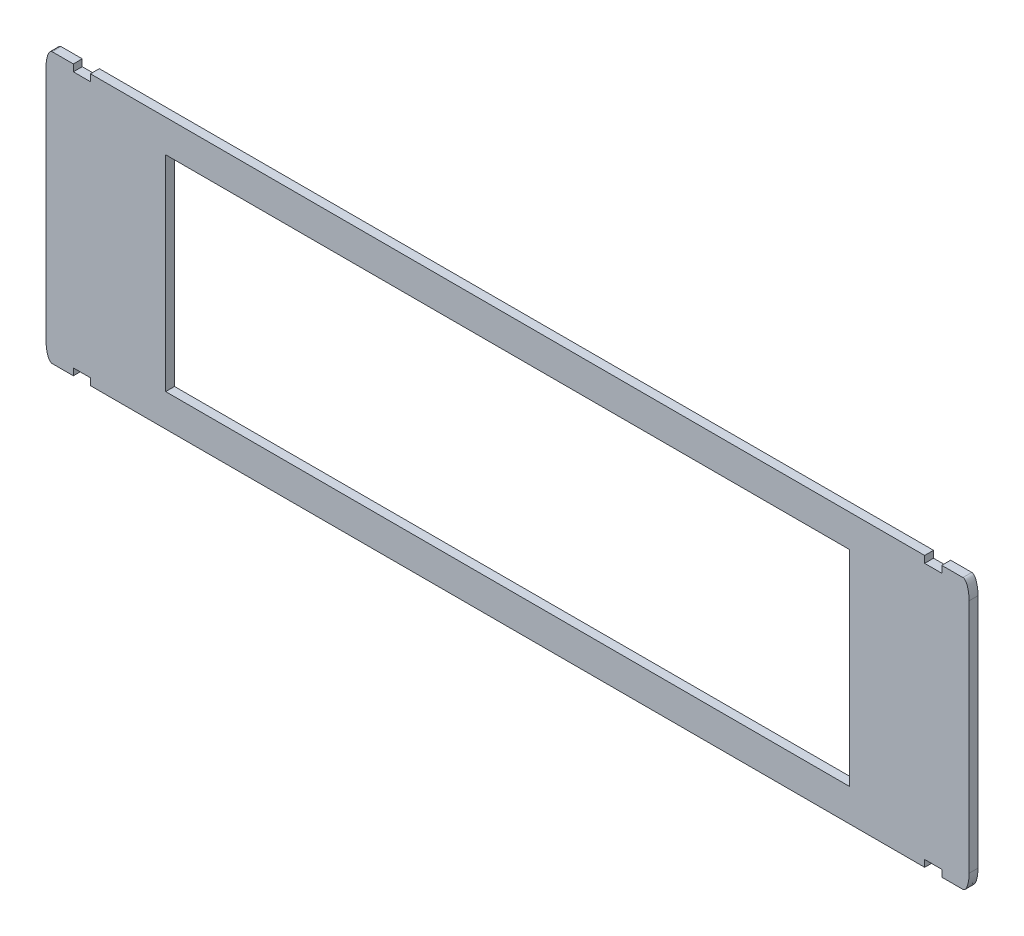
ISO-10303-21;
HEADER;
FILE_DESCRIPTION(('STEP AP214'),'2;1');
FILE_NAME('part.step','',(''),(''),'','','');
FILE_SCHEMA(('AUTOMOTIVE_DESIGN { 1 0 10303 214 1 1 1 1 }'));
ENDSEC;
DATA;
#1=APPLICATION_CONTEXT('core data for automotive mechanical design processes');
#2=APPLICATION_PROTOCOL_DEFINITION('international standard','automotive_design',2000,#1);
#3=PRODUCT_CONTEXT('',#1,'mechanical');
#4=PRODUCT('Part','Part','',(#3));
#5=PRODUCT_RELATED_PRODUCT_CATEGORY('part','',(#4));
#6=PRODUCT_DEFINITION_FORMATION('','',#4);
#7=PRODUCT_DEFINITION_CONTEXT('part definition',#1,'design');
#8=PRODUCT_DEFINITION('design','',#6,#7);
#9=PRODUCT_DEFINITION_SHAPE('','',#8);
#10=(LENGTH_UNIT() NAMED_UNIT(*) SI_UNIT(.MILLI.,.METRE.));
#11=(NAMED_UNIT(*) PLANE_ANGLE_UNIT() SI_UNIT($,.RADIAN.));
#12=(NAMED_UNIT(*) SI_UNIT($,.STERADIAN.) SOLID_ANGLE_UNIT());
#13=UNCERTAINTY_MEASURE_WITH_UNIT(LENGTH_MEASURE(1.E-05),#10,'distance_accuracy_value','');
#14=(GEOMETRIC_REPRESENTATION_CONTEXT(3) GLOBAL_UNCERTAINTY_ASSIGNED_CONTEXT((#13)) GLOBAL_UNIT_ASSIGNED_CONTEXT((#10,
#11,#12)) REPRESENTATION_CONTEXT('',''));
#15=CARTESIAN_POINT('',(0.,0.,0.));
#16=DIRECTION('',(0.,0.,1.));
#17=DIRECTION('',(1.,0.,0.));
#18=AXIS2_PLACEMENT_3D('',#15,#16,#17);
#19=CARTESIAN_POINT('',(-135.,-39.5,2.6));
#20=DIRECTION('',(0.,1.,0.));
#21=DIRECTION('',(0.,0.,1.));
#22=AXIS2_PLACEMENT_3D('',#19,#20,#21);
#23=PLANE('',#22);
#24=DIRECTION('',(1.,0.,0.));
#25=VECTOR('',#24,1.);
#26=CARTESIAN_POINT('',(-135.,-39.5,2.6));
#27=LINE('',#26,#25);
#28=CARTESIAN_POINT('',(127.,-39.5,2.6));
#29=VERTEX_POINT('',#28);
#30=CARTESIAN_POINT('',(133.2,-39.5,2.6));
#31=VERTEX_POINT('',#30);
#32=EDGE_CURVE('E482',#29,#31,#27,.T.);
#33=ORIENTED_EDGE('',*,*,#32,.F.);
#34=DIRECTION('',(0.,0.,-1.));
#35=VECTOR('',#34,1.);
#36=CARTESIAN_POINT('',(127.,-39.5,2.6));
#37=LINE('',#36,#35);
#38=CARTESIAN_POINT('',(127.,-39.5,0.));
#39=VERTEX_POINT('',#38);
#40=EDGE_CURVE('E57',#29,#39,#37,.T.);
#41=ORIENTED_EDGE('',*,*,#40,.T.);
#42=DIRECTION('',(1.,0.,0.));
#43=VECTOR('',#42,1.);
#44=CARTESIAN_POINT('',(-135.,-39.5,0.));
#45=LINE('',#44,#43);
#46=CARTESIAN_POINT('',(133.2,-39.5,0.));
#47=VERTEX_POINT('',#46);
#48=EDGE_CURVE('E463',#39,#47,#45,.T.);
#49=ORIENTED_EDGE('',*,*,#48,.T.);
#50=CARTESIAN_POINT('',(133.2,-39.5,2.73));
#51=CARTESIAN_POINT('',(133.2,-39.5,1.77666666666667));
#52=CARTESIAN_POINT('',(133.2,-39.5,0.823333333333334));
#53=CARTESIAN_POINT('',(133.2,-39.5,-0.13));
#54=(BOUNDED_CURVE() B_SPLINE_CURVE(3,(#50,#51,#52,#53),.UNSPECIFIED.,.F.,
.F.) B_SPLINE_CURVE_WITH_KNOTS((4,4),(-0.00013,0.00273),
.UNSPECIFIED.) CURVE() GEOMETRIC_REPRESENTATION_ITEM() RATIONAL_B_SPLINE_CURVE((1.,1.,1.,1.)) REPRESENTATION_ITEM(''));
#55=EDGE_CURVE('E653',#47,#31,#54,.F.);
#56=ORIENTED_EDGE('',*,*,#55,.T.);
#57=EDGE_LOOP('',(#33,#41,#49,#56));
#58=FACE_BOUND('',#57,.T.);
#59=ADVANCED_FACE('F44',(#58),#23,.F.);
#60=CARTESIAN_POINT('',(0.,0.,2.6));
#61=DIRECTION('',(0.,0.,1.));
#62=DIRECTION('',(1.,0.,0.));
#63=AXIS2_PLACEMENT_3D('',#60,#61,#62);
#64=PLANE('',#63);
#65=DIRECTION('',(0.,1.,0.));
#66=VECTOR('',#65,1.);
#67=CARTESIAN_POINT('',(127.,-39.5,2.6));
#68=LINE('',#67,#66);
#69=CARTESIAN_POINT('',(127.,-37.5,2.6));
#70=VERTEX_POINT('',#69);
#71=EDGE_CURVE('E247',#29,#70,#68,.T.);
#72=ORIENTED_EDGE('',*,*,#71,.F.);
#73=ORIENTED_EDGE('',*,*,#32,.T.);
#74=CARTESIAN_POINT('',(135.,-34.5,2.6));
#75=CARTESIAN_POINT('',(135.,-39.5,2.6));
#76=CARTESIAN_POINT('',(133.2,-39.5,2.6));
#77=(BOUNDED_CURVE() B_SPLINE_CURVE(2,(#74,#75,#76),.UNSPECIFIED.,.F.,
.F.) B_SPLINE_CURVE_WITH_KNOTS((3,3),(0.,1.),
.UNSPECIFIED.) CURVE() GEOMETRIC_REPRESENTATION_ITEM() RATIONAL_B_SPLINE_CURVE((1.,
0.707106781186548,1.)) REPRESENTATION_ITEM(''));
#78=CARTESIAN_POINT('',(135.,-34.5,2.6));
#79=VERTEX_POINT('',#78);
#80=EDGE_CURVE('E664',#31,#79,#77,.F.);
#81=ORIENTED_EDGE('',*,*,#80,.T.);
#82=DIRECTION('',(0.,1.,0.));
#83=VECTOR('',#82,1.);
#84=CARTESIAN_POINT('',(135.,39.5,2.6));
#85=LINE('',#84,#83);
#86=CARTESIAN_POINT('',(135.,34.5,2.6));
#87=VERTEX_POINT('',#86);
#88=EDGE_CURVE('E394',#79,#87,#85,.T.);
#89=ORIENTED_EDGE('',*,*,#88,.T.);
#90=CARTESIAN_POINT('',(133.2,39.5,2.6));
#91=CARTESIAN_POINT('',(135.,39.5,2.6));
#92=CARTESIAN_POINT('',(135.,34.5,2.6));
#93=(BOUNDED_CURVE() B_SPLINE_CURVE(2,(#90,#91,#92),.UNSPECIFIED.,.F.,
.F.) B_SPLINE_CURVE_WITH_KNOTS((3,3),(0.,1.),
.UNSPECIFIED.) CURVE() GEOMETRIC_REPRESENTATION_ITEM() RATIONAL_B_SPLINE_CURVE((1.,
0.707106781186548,1.)) REPRESENTATION_ITEM(''));
#94=CARTESIAN_POINT('',(133.2,39.5,2.6));
#95=VERTEX_POINT('',#94);
#96=EDGE_CURVE('E662',#87,#95,#93,.F.);
#97=ORIENTED_EDGE('',*,*,#96,.T.);
#98=DIRECTION('',(-1.,0.,0.));
#99=VECTOR('',#98,1.);
#100=CARTESIAN_POINT('',(-135.,39.5,2.6));
#101=LINE('',#100,#99);
#102=CARTESIAN_POINT('',(127.,39.5,2.6));
#103=VERTEX_POINT('',#102);
#104=EDGE_CURVE('E568',#95,#103,#101,.T.);
#105=ORIENTED_EDGE('',*,*,#104,.T.);
#106=DIRECTION('',(0.,-1.,0.));
#107=VECTOR('',#106,1.);
#108=CARTESIAN_POINT('',(127.,39.5,2.6));
#109=LINE('',#108,#107);
#110=CARTESIAN_POINT('',(127.,37.5,2.6));
#111=VERTEX_POINT('',#110);
#112=EDGE_CURVE('E271',#103,#111,#109,.T.);
#113=ORIENTED_EDGE('',*,*,#112,.T.);
#114=DIRECTION('',(-1.,0.,0.));
#115=VECTOR('',#114,1.);
#116=CARTESIAN_POINT('',(127.,37.5,2.6));
#117=LINE('',#116,#115);
#118=CARTESIAN_POINT('',(122.,37.5,2.6));
#119=VERTEX_POINT('',#118);
#120=EDGE_CURVE('E279',#111,#119,#117,.T.);
#121=ORIENTED_EDGE('',*,*,#120,.T.);
#122=DIRECTION('',(0.,1.,0.));
#123=VECTOR('',#122,1.);
#124=CARTESIAN_POINT('',(122.,39.5,2.6));
#125=LINE('',#124,#123);
#126=CARTESIAN_POINT('',(122.,39.5,2.6));
#127=VERTEX_POINT('',#126);
#128=EDGE_CURVE('E275',#119,#127,#125,.T.);
#129=ORIENTED_EDGE('',*,*,#128,.T.);
#130=CARTESIAN_POINT('',(-122.,39.5,2.6));
#131=VERTEX_POINT('',#130);
#132=EDGE_CURVE('E566',#127,#131,#101,.T.);
#133=ORIENTED_EDGE('',*,*,#132,.T.);
#134=DIRECTION('',(0.,1.,0.));
#135=VECTOR('',#134,1.);
#136=CARTESIAN_POINT('',(-122.,39.5,2.6));
#137=LINE('',#136,#135);
#138=CARTESIAN_POINT('',(-122.,37.5,2.6));
#139=VERTEX_POINT('',#138);
#140=EDGE_CURVE('E327',#139,#131,#137,.T.);
#141=ORIENTED_EDGE('',*,*,#140,.F.);
#142=DIRECTION('',(1.,0.,0.));
#143=VECTOR('',#142,1.);
#144=CARTESIAN_POINT('',(-127.,37.5,2.6));
#145=LINE('',#144,#143);
#146=CARTESIAN_POINT('',(-127.,37.5,2.6));
#147=VERTEX_POINT('',#146);
#148=EDGE_CURVE('E323',#147,#139,#145,.T.);
#149=ORIENTED_EDGE('',*,*,#148,.F.);
#150=DIRECTION('',(0.,-1.,0.));
#151=VECTOR('',#150,1.);
#152=CARTESIAN_POINT('',(-127.,39.5,2.6));
#153=LINE('',#152,#151);
#154=CARTESIAN_POINT('',(-127.,39.5,2.6));
#155=VERTEX_POINT('',#154);
#156=EDGE_CURVE('E310',#155,#147,#153,.T.);
#157=ORIENTED_EDGE('',*,*,#156,.F.);
#158=CARTESIAN_POINT('',(-133.2,39.5,2.6));
#159=VERTEX_POINT('',#158);
#160=EDGE_CURVE('E399',#155,#159,#101,.T.);
#161=ORIENTED_EDGE('',*,*,#160,.T.);
#162=CARTESIAN_POINT('',(-135.,34.5,2.6));
#163=CARTESIAN_POINT('',(-135.,39.5,2.6));
#164=CARTESIAN_POINT('',(-133.2,39.5,2.6));
#165=(BOUNDED_CURVE() B_SPLINE_CURVE(2,(#162,#163,#164),.UNSPECIFIED.,.F.,
.F.) B_SPLINE_CURVE_WITH_KNOTS((3,3),(0.,1.),
.UNSPECIFIED.) CURVE() GEOMETRIC_REPRESENTATION_ITEM() RATIONAL_B_SPLINE_CURVE((1.,
0.707106781186548,1.)) REPRESENTATION_ITEM(''));
#166=CARTESIAN_POINT('',(-135.,34.5,2.6));
#167=VERTEX_POINT('',#166);
#168=EDGE_CURVE('E655',#159,#167,#165,.F.);
#169=ORIENTED_EDGE('',*,*,#168,.T.);
#170=DIRECTION('',(0.,-1.,0.));
#171=VECTOR('',#170,1.);
#172=CARTESIAN_POINT('',(-135.,39.5,2.6));
#173=LINE('',#172,#171);
#174=CARTESIAN_POINT('',(-135.,-34.5,2.6));
#175=VERTEX_POINT('',#174);
#176=EDGE_CURVE('E496',#167,#175,#173,.T.);
#177=ORIENTED_EDGE('',*,*,#176,.T.);
#178=CARTESIAN_POINT('',(-133.2,-39.5,2.6));
#179=CARTESIAN_POINT('',(-135.,-39.5,2.6));
#180=CARTESIAN_POINT('',(-135.,-34.5,2.6));
#181=(BOUNDED_CURVE() B_SPLINE_CURVE(2,(#178,#179,#180),.UNSPECIFIED.,.F.,
.F.) B_SPLINE_CURVE_WITH_KNOTS((3,3),(0.,1.),
.UNSPECIFIED.) CURVE() GEOMETRIC_REPRESENTATION_ITEM() RATIONAL_B_SPLINE_CURVE((1.,
0.707106781186548,1.)) REPRESENTATION_ITEM(''));
#182=CARTESIAN_POINT('',(-133.2,-39.5,2.6));
#183=VERTEX_POINT('',#182);
#184=EDGE_CURVE('E635',#175,#183,#181,.F.);
#185=ORIENTED_EDGE('',*,*,#184,.T.);
#186=CARTESIAN_POINT('',(-127.,-39.5,2.6));
#187=VERTEX_POINT('',#186);
#188=EDGE_CURVE('E481',#183,#187,#27,.T.);
#189=ORIENTED_EDGE('',*,*,#188,.T.);
#190=DIRECTION('',(0.,1.,0.));
#191=VECTOR('',#190,1.);
#192=CARTESIAN_POINT('',(-127.,-39.5,2.6));
#193=LINE('',#192,#191);
#194=CARTESIAN_POINT('',(-127.,-37.5,2.6));
#195=VERTEX_POINT('',#194);
#196=EDGE_CURVE('E294',#187,#195,#193,.T.);
#197=ORIENTED_EDGE('',*,*,#196,.T.);
#198=DIRECTION('',(1.,0.,0.));
#199=VECTOR('',#198,1.);
#200=CARTESIAN_POINT('',(-127.,-37.5,2.6));
#201=LINE('',#200,#199);
#202=CARTESIAN_POINT('',(-122.,-37.5,2.6));
#203=VERTEX_POINT('',#202);
#204=EDGE_CURVE('E302',#195,#203,#201,.T.);
#205=ORIENTED_EDGE('',*,*,#204,.T.);
#206=DIRECTION('',(0.,-1.,0.));
#207=VECTOR('',#206,1.);
#208=CARTESIAN_POINT('',(-122.,-39.5,2.6));
#209=LINE('',#208,#207);
#210=CARTESIAN_POINT('',(-122.,-39.5,2.6));
#211=VERTEX_POINT('',#210);
#212=EDGE_CURVE('E298',#203,#211,#209,.T.);
#213=ORIENTED_EDGE('',*,*,#212,.T.);
#214=CARTESIAN_POINT('',(122.,-39.5,2.6));
#215=VERTEX_POINT('',#214);
#216=EDGE_CURVE('E477',#211,#215,#27,.T.);
#217=ORIENTED_EDGE('',*,*,#216,.T.);
#218=DIRECTION('',(0.,-1.,0.));
#219=VECTOR('',#218,1.);
#220=CARTESIAN_POINT('',(122.,-39.5,2.6));
#221=LINE('',#220,#219);
#222=CARTESIAN_POINT('',(122.,-37.5,2.6));
#223=VERTEX_POINT('',#222);
#224=EDGE_CURVE('E64',#223,#215,#221,.T.);
#225=ORIENTED_EDGE('',*,*,#224,.F.);
#226=DIRECTION('',(-1.,0.,0.));
#227=VECTOR('',#226,1.);
#228=CARTESIAN_POINT('',(127.,-37.5,2.6));
#229=LINE('',#228,#227);
#230=EDGE_CURVE('E240',#70,#223,#229,.T.);
#231=ORIENTED_EDGE('',*,*,#230,.F.);
#232=EDGE_LOOP('',(#72,#73,#81,#89,#97,#105,#113,#121,#129,#133,#141,#149,#157,#161,#169,#177,
#185,#189,#197,#205,#213,#217,#225,#231));
#233=FACE_BOUND('',#232,.T.);
#234=DIRECTION('',(0.,1.,0.));
#235=VECTOR('',#234,1.);
#236=CARTESIAN_POINT('',(100.,30.,2.6));
#237=LINE('',#236,#235);
#238=CARTESIAN_POINT('',(100.,-30.,2.6));
#239=VERTEX_POINT('',#238);
#240=CARTESIAN_POINT('',(100.,30.,2.6));
#241=VERTEX_POINT('',#240);
#242=EDGE_CURVE('E335',#239,#241,#237,.T.);
#243=ORIENTED_EDGE('',*,*,#242,.F.);
#244=DIRECTION('',(1.,0.,0.));
#245=VECTOR('',#244,1.);
#246=CARTESIAN_POINT('',(-100.,-30.,2.6));
#247=LINE('',#246,#245);
#248=CARTESIAN_POINT('',(-100.,-30.,2.6));
#249=VERTEX_POINT('',#248);
#250=EDGE_CURVE('E350',#249,#239,#247,.T.);
#251=ORIENTED_EDGE('',*,*,#250,.F.);
#252=DIRECTION('',(0.,-1.,0.));
#253=VECTOR('',#252,1.);
#254=CARTESIAN_POINT('',(-100.,30.,2.6));
#255=LINE('',#254,#253);
#256=CARTESIAN_POINT('',(-100.,30.,2.6));
#257=VERTEX_POINT('',#256);
#258=EDGE_CURVE('E369',#257,#249,#255,.T.);
#259=ORIENTED_EDGE('',*,*,#258,.F.);
#260=DIRECTION('',(-1.,0.,0.));
#261=VECTOR('',#260,1.);
#262=CARTESIAN_POINT('',(-100.,30.,2.6));
#263=LINE('',#262,#261);
#264=EDGE_CURVE('E365',#241,#257,#263,.T.);
#265=ORIENTED_EDGE('',*,*,#264,.F.);
#266=EDGE_LOOP('',(#243,#251,#259,#265));
#267=FACE_BOUND('',#266,.T.);
#268=ADVANCED_FACE('F254',(#233,#267),#64,.T.);
#269=CARTESIAN_POINT('',(0.,0.,0.));
#270=DIRECTION('',(0.,0.,1.));
#271=DIRECTION('',(1.,0.,0.));
#272=AXIS2_PLACEMENT_3D('',#269,#270,#271);
#273=PLANE('',#272);
#274=ORIENTED_EDGE('',*,*,#48,.F.);
#275=DIRECTION('',(0.,1.,0.));
#276=VECTOR('',#275,1.);
#277=CARTESIAN_POINT('',(127.,0.,0.));
#278=LINE('',#277,#276);
#279=CARTESIAN_POINT('',(127.,-37.5,0.));
#280=VERTEX_POINT('',#279);
#281=EDGE_CURVE('E268',#39,#280,#278,.T.);
#282=ORIENTED_EDGE('',*,*,#281,.T.);
#283=DIRECTION('',(-1.,0.,0.));
#284=VECTOR('',#283,1.);
#285=CARTESIAN_POINT('',(0.,-37.5,0.));
#286=LINE('',#285,#284);
#287=CARTESIAN_POINT('',(122.,-37.5,0.));
#288=VERTEX_POINT('',#287);
#289=EDGE_CURVE('E12',#280,#288,#286,.T.);
#290=ORIENTED_EDGE('',*,*,#289,.T.);
#291=DIRECTION('',(0.,-1.,0.));
#292=VECTOR('',#291,1.);
#293=CARTESIAN_POINT('',(122.,0.,0.));
#294=LINE('',#293,#292);
#295=CARTESIAN_POINT('',(122.,-39.5,0.));
#296=VERTEX_POINT('',#295);
#297=EDGE_CURVE('E263',#288,#296,#294,.T.);
#298=ORIENTED_EDGE('',*,*,#297,.T.);
#299=CARTESIAN_POINT('',(-122.,-39.5,0.));
#300=VERTEX_POINT('',#299);
#301=EDGE_CURVE('E448',#300,#296,#45,.T.);
#302=ORIENTED_EDGE('',*,*,#301,.F.);
#303=DIRECTION('',(0.,-1.,0.));
#304=VECTOR('',#303,1.);
#305=CARTESIAN_POINT('',(-122.,0.,0.));
#306=LINE('',#305,#304);
#307=CARTESIAN_POINT('',(-122.,-37.5,0.));
#308=VERTEX_POINT('',#307);
#309=EDGE_CURVE('E465',#308,#300,#306,.T.);
#310=ORIENTED_EDGE('',*,*,#309,.F.);
#311=DIRECTION('',(1.,0.,0.));
#312=VECTOR('',#311,1.);
#313=CARTESIAN_POINT('',(0.,-37.5,0.));
#314=LINE('',#313,#312);
#315=CARTESIAN_POINT('',(-127.,-37.5,0.));
#316=VERTEX_POINT('',#315);
#317=EDGE_CURVE('E468',#316,#308,#314,.T.);
#318=ORIENTED_EDGE('',*,*,#317,.F.);
#319=DIRECTION('',(0.,1.,0.));
#320=VECTOR('',#319,1.);
#321=CARTESIAN_POINT('',(-127.,0.,0.));
#322=LINE('',#321,#320);
#323=CARTESIAN_POINT('',(-127.,-39.5,0.));
#324=VERTEX_POINT('',#323);
#325=EDGE_CURVE('E473',#324,#316,#322,.T.);
#326=ORIENTED_EDGE('',*,*,#325,.F.);
#327=CARTESIAN_POINT('',(-133.2,-39.5,0.));
#328=VERTEX_POINT('',#327);
#329=EDGE_CURVE('E400',#328,#324,#45,.T.);
#330=ORIENTED_EDGE('',*,*,#329,.F.);
#331=CARTESIAN_POINT('',(-135.,-34.5,0.));
#332=CARTESIAN_POINT('',(-135.,-39.5,0.));
#333=CARTESIAN_POINT('',(-133.2,-39.5,0.));
#334=(BOUNDED_CURVE() B_SPLINE_CURVE(2,(#331,#332,#333),.UNSPECIFIED.,.F.,
.F.) B_SPLINE_CURVE_WITH_KNOTS((3,3),(0.,1.),
.UNSPECIFIED.) CURVE() GEOMETRIC_REPRESENTATION_ITEM() RATIONAL_B_SPLINE_CURVE((1.,
0.707106781186548,1.)) REPRESENTATION_ITEM(''));
#335=CARTESIAN_POINT('',(-135.,-34.5,0.));
#336=VERTEX_POINT('',#335);
#337=EDGE_CURVE('E644',#328,#336,#334,.F.);
#338=ORIENTED_EDGE('',*,*,#337,.T.);
#339=DIRECTION('',(0.,-1.,0.));
#340=VECTOR('',#339,1.);
#341=CARTESIAN_POINT('',(-135.,39.5,0.));
#342=LINE('',#341,#340);
#343=CARTESIAN_POINT('',(-135.,34.5,0.));
#344=VERTEX_POINT('',#343);
#345=EDGE_CURVE('E449',#344,#336,#342,.T.);
#346=ORIENTED_EDGE('',*,*,#345,.F.);
#347=CARTESIAN_POINT('',(-133.2,39.5,0.));
#348=CARTESIAN_POINT('',(-135.,39.5,0.));
#349=CARTESIAN_POINT('',(-135.,34.5,0.));
#350=(BOUNDED_CURVE() B_SPLINE_CURVE(2,(#347,#348,#349),.UNSPECIFIED.,.F.,
.F.) B_SPLINE_CURVE_WITH_KNOTS((3,3),(0.,1.),
.UNSPECIFIED.) CURVE() GEOMETRIC_REPRESENTATION_ITEM() RATIONAL_B_SPLINE_CURVE((1.,
0.707106781186548,1.)) REPRESENTATION_ITEM(''));
#351=CARTESIAN_POINT('',(-133.2,39.5,0.));
#352=VERTEX_POINT('',#351);
#353=EDGE_CURVE('E641',#344,#352,#350,.F.);
#354=ORIENTED_EDGE('',*,*,#353,.T.);
#355=DIRECTION('',(-1.,0.,0.));
#356=VECTOR('',#355,1.);
#357=CARTESIAN_POINT('',(-135.,39.5,0.));
#358=LINE('',#357,#356);
#359=CARTESIAN_POINT('',(-127.,39.5,0.));
#360=VERTEX_POINT('',#359);
#361=EDGE_CURVE('E528',#360,#352,#358,.T.);
#362=ORIENTED_EDGE('',*,*,#361,.F.);
#363=DIRECTION('',(0.,-1.,0.));
#364=VECTOR('',#363,1.);
#365=CARTESIAN_POINT('',(-127.,0.,0.));
#366=LINE('',#365,#364);
#367=CARTESIAN_POINT('',(-127.,37.5,0.));
#368=VERTEX_POINT('',#367);
#369=EDGE_CURVE('E469',#360,#368,#366,.T.);
#370=ORIENTED_EDGE('',*,*,#369,.T.);
#371=DIRECTION('',(1.,0.,0.));
#372=VECTOR('',#371,1.);
#373=CARTESIAN_POINT('',(0.,37.5,0.));
#374=LINE('',#373,#372);
#375=CARTESIAN_POINT('',(-122.,37.5,0.));
#376=VERTEX_POINT('',#375);
#377=EDGE_CURVE('E542',#368,#376,#374,.T.);
#378=ORIENTED_EDGE('',*,*,#377,.T.);
#379=DIRECTION('',(0.,1.,0.));
#380=VECTOR('',#379,1.);
#381=CARTESIAN_POINT('',(-122.,0.,0.));
#382=LINE('',#381,#380);
#383=CARTESIAN_POINT('',(-122.,39.5,0.));
#384=VERTEX_POINT('',#383);
#385=EDGE_CURVE('E546',#376,#384,#382,.T.);
#386=ORIENTED_EDGE('',*,*,#385,.T.);
#387=CARTESIAN_POINT('',(122.,39.5,0.));
#388=VERTEX_POINT('',#387);
#389=EDGE_CURVE('E483',#388,#384,#358,.T.);
#390=ORIENTED_EDGE('',*,*,#389,.F.);
#391=DIRECTION('',(0.,1.,0.));
#392=VECTOR('',#391,1.);
#393=CARTESIAN_POINT('',(122.,0.,0.));
#394=LINE('',#393,#392);
#395=CARTESIAN_POINT('',(122.,37.5,0.));
#396=VERTEX_POINT('',#395);
#397=EDGE_CURVE('E72',#396,#388,#394,.T.);
#398=ORIENTED_EDGE('',*,*,#397,.F.);
#399=DIRECTION('',(-1.,0.,0.));
#400=VECTOR('',#399,1.);
#401=CARTESIAN_POINT('',(0.,37.5,0.));
#402=LINE('',#401,#400);
#403=CARTESIAN_POINT('',(127.,37.5,0.));
#404=VERTEX_POINT('',#403);
#405=EDGE_CURVE('E500',#404,#396,#402,.T.);
#406=ORIENTED_EDGE('',*,*,#405,.F.);
#407=DIRECTION('',(0.,-1.,0.));
#408=VECTOR('',#407,1.);
#409=CARTESIAN_POINT('',(127.,0.,0.));
#410=LINE('',#409,#408);
#411=CARTESIAN_POINT('',(127.,39.5,0.));
#412=VERTEX_POINT('',#411);
#413=EDGE_CURVE('E291',#412,#404,#410,.T.);
#414=ORIENTED_EDGE('',*,*,#413,.F.);
#415=CARTESIAN_POINT('',(133.2,39.5,0.));
#416=VERTEX_POINT('',#415);
#417=EDGE_CURVE('E516',#416,#412,#358,.T.);
#418=ORIENTED_EDGE('',*,*,#417,.F.);
#419=CARTESIAN_POINT('',(135.,34.5,0.));
#420=CARTESIAN_POINT('',(135.,39.5,0.));
#421=CARTESIAN_POINT('',(133.2,39.5,0.));
#422=(BOUNDED_CURVE() B_SPLINE_CURVE(2,(#419,#420,#421),.UNSPECIFIED.,.F.,
.F.) B_SPLINE_CURVE_WITH_KNOTS((3,3),(0.,1.),
.UNSPECIFIED.) CURVE() GEOMETRIC_REPRESENTATION_ITEM() RATIONAL_B_SPLINE_CURVE((1.,
0.707106781186548,1.)) REPRESENTATION_ITEM(''));
#423=CARTESIAN_POINT('',(135.,34.5,0.));
#424=VERTEX_POINT('',#423);
#425=EDGE_CURVE('E646',#416,#424,#422,.F.);
#426=ORIENTED_EDGE('',*,*,#425,.T.);
#427=DIRECTION('',(0.,1.,0.));
#428=VECTOR('',#427,1.);
#429=CARTESIAN_POINT('',(135.,39.5,0.));
#430=LINE('',#429,#428);
#431=CARTESIAN_POINT('',(135.,-34.5,0.));
#432=VERTEX_POINT('',#431);
#433=EDGE_CURVE('E379',#432,#424,#430,.T.);
#434=ORIENTED_EDGE('',*,*,#433,.F.);
#435=CARTESIAN_POINT('',(133.2,-39.5,0.));
#436=CARTESIAN_POINT('',(135.,-39.5,0.));
#437=CARTESIAN_POINT('',(135.,-34.5,0.));
#438=(BOUNDED_CURVE() B_SPLINE_CURVE(2,(#435,#436,#437),.UNSPECIFIED.,.F.,
.F.) B_SPLINE_CURVE_WITH_KNOTS((3,3),(0.,1.),
.UNSPECIFIED.) CURVE() GEOMETRIC_REPRESENTATION_ITEM() RATIONAL_B_SPLINE_CURVE((1.,
0.707106781186548,1.)) REPRESENTATION_ITEM(''));
#439=EDGE_CURVE('E510',#432,#47,#438,.F.);
#440=ORIENTED_EDGE('',*,*,#439,.T.);
#441=EDGE_LOOP('',(#274,#282,#290,#298,#302,#310,#318,#326,#330,#338,#346,#354,#362,#370,#378,
#386,#390,#398,#406,#414,#418,#426,#434,#440));
#442=FACE_BOUND('',#441,.T.);
#443=DIRECTION('',(1.,0.,0.));
#444=VECTOR('',#443,1.);
#445=CARTESIAN_POINT('',(-100.,-30.,0.));
#446=LINE('',#445,#444);
#447=CARTESIAN_POINT('',(-100.,-30.,0.));
#448=VERTEX_POINT('',#447);
#449=CARTESIAN_POINT('',(100.,-30.,0.));
#450=VERTEX_POINT('',#449);
#451=EDGE_CURVE('E358',#448,#450,#446,.T.);
#452=ORIENTED_EDGE('',*,*,#451,.T.);
#453=DIRECTION('',(0.,1.,0.));
#454=VECTOR('',#453,1.);
#455=CARTESIAN_POINT('',(100.,30.,0.));
#456=LINE('',#455,#454);
#457=CARTESIAN_POINT('',(100.,30.,0.));
#458=VERTEX_POINT('',#457);
#459=EDGE_CURVE('E345',#450,#458,#456,.T.);
#460=ORIENTED_EDGE('',*,*,#459,.T.);
#461=DIRECTION('',(-1.,0.,0.));
#462=VECTOR('',#461,1.);
#463=CARTESIAN_POINT('',(-100.,30.,0.));
#464=LINE('',#463,#462);
#465=CARTESIAN_POINT('',(-100.,30.,0.));
#466=VERTEX_POINT('',#465);
#467=EDGE_CURVE('E349',#458,#466,#464,.T.);
#468=ORIENTED_EDGE('',*,*,#467,.T.);
#469=DIRECTION('',(0.,-1.,0.));
#470=VECTOR('',#469,1.);
#471=CARTESIAN_POINT('',(-100.,30.,0.));
#472=LINE('',#471,#470);
#473=EDGE_CURVE('E354',#466,#448,#472,.T.);
#474=ORIENTED_EDGE('',*,*,#473,.T.);
#475=EDGE_LOOP('',(#452,#460,#468,#474));
#476=FACE_BOUND('',#475,.T.);
#477=ADVANCED_FACE('F507',(#442,#476),#273,.F.);
#478=CARTESIAN_POINT('',(-135.,39.5,2.6));
#479=DIRECTION('',(0.,-1.,0.));
#480=DIRECTION('',(0.,0.,-1.));
#481=AXIS2_PLACEMENT_3D('',#478,#479,#480);
#482=PLANE('',#481);
#483=DIRECTION('',(0.,0.,-1.));
#484=VECTOR('',#483,1.);
#485=CARTESIAN_POINT('',(127.,39.5,2.6));
#486=LINE('',#485,#484);
#487=EDGE_CURVE('E577',#103,#412,#486,.T.);
#488=ORIENTED_EDGE('',*,*,#487,.F.);
#489=ORIENTED_EDGE('',*,*,#104,.F.);
#490=CARTESIAN_POINT('',(133.2,39.5,-0.13));
#491=CARTESIAN_POINT('',(133.2,39.5,0.823333333333334));
#492=CARTESIAN_POINT('',(133.2,39.5,1.77666666666667));
#493=CARTESIAN_POINT('',(133.2,39.5,2.73));
#494=(BOUNDED_CURVE() B_SPLINE_CURVE(3,(#490,#491,#492,#493),.UNSPECIFIED.,.F.,
.F.) B_SPLINE_CURVE_WITH_KNOTS((4,4),(-0.00013,0.00273),
.UNSPECIFIED.) CURVE() GEOMETRIC_REPRESENTATION_ITEM() RATIONAL_B_SPLINE_CURVE((1.,1.,1.,1.)) REPRESENTATION_ITEM(''));
#495=EDGE_CURVE('E671',#95,#416,#494,.F.);
#496=ORIENTED_EDGE('',*,*,#495,.T.);
#497=ORIENTED_EDGE('',*,*,#417,.T.);
#498=EDGE_LOOP('',(#488,#489,#496,#497));
#499=FACE_BOUND('',#498,.T.);
#500=ADVANCED_FACE('F427',(#499),#482,.F.);
#501=DIRECTION('',(0.,0.,1.));
#502=VECTOR('',#501,1.);
#503=CARTESIAN_POINT('',(122.,39.5,2.6));
#504=LINE('',#503,#502);
#505=EDGE_CURVE('E476',#388,#127,#504,.T.);
#506=ORIENTED_EDGE('',*,*,#505,.F.);
#507=ORIENTED_EDGE('',*,*,#389,.T.);
#508=DIRECTION('',(0.,0.,1.));
#509=VECTOR('',#508,1.);
#510=CARTESIAN_POINT('',(-122.,39.5,-0.0170000000000001));
#511=LINE('',#510,#509);
#512=EDGE_CURVE('E336',#384,#131,#511,.T.);
#513=ORIENTED_EDGE('',*,*,#512,.T.);
#514=ORIENTED_EDGE('',*,*,#132,.F.);
#515=EDGE_LOOP('',(#506,#507,#513,#514));
#516=FACE_BOUND('',#515,.T.);
#517=ADVANCED_FACE('F592',(#516),#482,.F.);
#518=DIRECTION('',(0.,0.,1.));
#519=VECTOR('',#518,1.);
#520=CARTESIAN_POINT('',(-127.,-39.5,-0.0170000000000001));
#521=LINE('',#520,#519);
#522=EDGE_CURVE('E306',#324,#187,#521,.T.);
#523=ORIENTED_EDGE('',*,*,#522,.T.);
#524=ORIENTED_EDGE('',*,*,#188,.F.);
#525=CARTESIAN_POINT('',(-133.2,-39.5,-0.13));
#526=CARTESIAN_POINT('',(-133.2,-39.5,0.823333333333334));
#527=CARTESIAN_POINT('',(-133.2,-39.5,1.77666666666667));
#528=CARTESIAN_POINT('',(-133.2,-39.5,2.73));
#529=(BOUNDED_CURVE() B_SPLINE_CURVE(3,(#525,#526,#527,#528),.UNSPECIFIED.,.F.,
.F.) B_SPLINE_CURVE_WITH_KNOTS((4,4),(-0.00013,0.00273),
.UNSPECIFIED.) CURVE() GEOMETRIC_REPRESENTATION_ITEM() RATIONAL_B_SPLINE_CURVE((1.,1.,1.,1.)) REPRESENTATION_ITEM(''));
#530=EDGE_CURVE('E651',#183,#328,#529,.F.);
#531=ORIENTED_EDGE('',*,*,#530,.T.);
#532=ORIENTED_EDGE('',*,*,#329,.T.);
#533=EDGE_LOOP('',(#523,#524,#531,#532));
#534=FACE_BOUND('',#533,.T.);
#535=ADVANCED_FACE('F613',(#534),#23,.F.);
#536=ORIENTED_EDGE('',*,*,#301,.T.);
#537=DIRECTION('',(0.,0.,1.));
#538=VECTOR('',#537,1.);
#539=CARTESIAN_POINT('',(122.,-39.5,2.6));
#540=LINE('',#539,#538);
#541=EDGE_CURVE('E498',#296,#215,#540,.T.);
#542=ORIENTED_EDGE('',*,*,#541,.T.);
#543=ORIENTED_EDGE('',*,*,#216,.F.);
#544=DIRECTION('',(0.,0.,1.));
#545=VECTOR('',#544,1.);
#546=CARTESIAN_POINT('',(-122.,-39.5,-0.0170000000000001));
#547=LINE('',#546,#545);
#548=EDGE_CURVE('E314',#300,#211,#547,.T.);
#549=ORIENTED_EDGE('',*,*,#548,.F.);
#550=EDGE_LOOP('',(#536,#542,#543,#549));
#551=FACE_BOUND('',#550,.T.);
#552=ADVANCED_FACE('F612',(#551),#23,.F.);
#553=ORIENTED_EDGE('',*,*,#160,.F.);
#554=DIRECTION('',(0.,0.,1.));
#555=VECTOR('',#554,1.);
#556=CARTESIAN_POINT('',(-127.,39.5,-0.0170000000000001));
#557=LINE('',#556,#555);
#558=EDGE_CURVE('E332',#360,#155,#557,.T.);
#559=ORIENTED_EDGE('',*,*,#558,.F.);
#560=ORIENTED_EDGE('',*,*,#361,.T.);
#561=CARTESIAN_POINT('',(-133.2,39.5,2.73));
#562=CARTESIAN_POINT('',(-133.2,39.5,1.77666666666667));
#563=CARTESIAN_POINT('',(-133.2,39.5,0.823333333333334));
#564=CARTESIAN_POINT('',(-133.2,39.5,-0.13));
#565=(BOUNDED_CURVE() B_SPLINE_CURVE(3,(#561,#562,#563,#564),.UNSPECIFIED.,.F.,
.F.) B_SPLINE_CURVE_WITH_KNOTS((4,4),(-0.00013,0.00273),
.UNSPECIFIED.) CURVE() GEOMETRIC_REPRESENTATION_ITEM() RATIONAL_B_SPLINE_CURVE((1.,1.,1.,1.)) REPRESENTATION_ITEM(''));
#566=EDGE_CURVE('E562',#352,#159,#565,.F.);
#567=ORIENTED_EDGE('',*,*,#566,.T.);
#568=EDGE_LOOP('',(#553,#559,#560,#567));
#569=FACE_BOUND('',#568,.T.);
#570=ADVANCED_FACE('F426',(#569),#482,.F.);
#571=CARTESIAN_POINT('',(135.,39.5,2.6));
#572=DIRECTION('',(-1.,0.,0.));
#573=DIRECTION('',(0.,0.,1.));
#574=AXIS2_PLACEMENT_3D('',#571,#572,#573);
#575=PLANE('',#574);
#576=ORIENTED_EDGE('',*,*,#88,.F.);
#577=CARTESIAN_POINT('',(135.,-34.5,-0.13));
#578=CARTESIAN_POINT('',(135.,-34.5,0.823333333333334));
#579=CARTESIAN_POINT('',(135.,-34.5,1.77666666666667));
#580=CARTESIAN_POINT('',(135.,-34.5,2.73));
#581=(BOUNDED_CURVE() B_SPLINE_CURVE(3,(#577,#578,#579,#580),.UNSPECIFIED.,.F.,
.F.) B_SPLINE_CURVE_WITH_KNOTS((4,4),(-0.00013,0.00273),
.UNSPECIFIED.) CURVE() GEOMETRIC_REPRESENTATION_ITEM() RATIONAL_B_SPLINE_CURVE((1.,1.,1.,1.)) REPRESENTATION_ITEM(''));
#582=EDGE_CURVE('E639',#79,#432,#581,.F.);
#583=ORIENTED_EDGE('',*,*,#582,.T.);
#584=ORIENTED_EDGE('',*,*,#433,.T.);
#585=CARTESIAN_POINT('',(135.,34.5,2.73));
#586=CARTESIAN_POINT('',(135.,34.5,1.77666666666667));
#587=CARTESIAN_POINT('',(135.,34.5,0.823333333333334));
#588=CARTESIAN_POINT('',(135.,34.5,-0.13));
#589=(BOUNDED_CURVE() B_SPLINE_CURVE(3,(#585,#586,#587,#588),.UNSPECIFIED.,.F.,
.F.) B_SPLINE_CURVE_WITH_KNOTS((4,4),(-0.00013,0.00273),
.UNSPECIFIED.) CURVE() GEOMETRIC_REPRESENTATION_ITEM() RATIONAL_B_SPLINE_CURVE((1.,1.,1.,1.)) REPRESENTATION_ITEM(''));
#590=EDGE_CURVE('E408',#424,#87,#589,.F.);
#591=ORIENTED_EDGE('',*,*,#590,.T.);
#592=EDGE_LOOP('',(#576,#583,#584,#591));
#593=FACE_BOUND('',#592,.T.);
#594=ADVANCED_FACE('F415',(#593),#575,.F.);
#595=CARTESIAN_POINT('',(-135.,39.5,2.6));
#596=DIRECTION('',(1.,0.,0.));
#597=DIRECTION('',(0.,0.,-1.));
#598=AXIS2_PLACEMENT_3D('',#595,#596,#597);
#599=PLANE('',#598);
#600=ORIENTED_EDGE('',*,*,#345,.T.);
#601=CARTESIAN_POINT('',(-135.,-34.5,2.73));
#602=CARTESIAN_POINT('',(-135.,-34.5,1.77666666666667));
#603=CARTESIAN_POINT('',(-135.,-34.5,0.823333333333334));
#604=CARTESIAN_POINT('',(-135.,-34.5,-0.13));
#605=(BOUNDED_CURVE() B_SPLINE_CURVE(3,(#601,#602,#603,#604),.UNSPECIFIED.,.F.,
.F.) B_SPLINE_CURVE_WITH_KNOTS((4,4),(-0.00013,0.00273),
.UNSPECIFIED.) CURVE() GEOMETRIC_REPRESENTATION_ITEM() RATIONAL_B_SPLINE_CURVE((1.,1.,1.,1.)) REPRESENTATION_ITEM(''));
#606=EDGE_CURVE('E547',#336,#175,#605,.F.);
#607=ORIENTED_EDGE('',*,*,#606,.T.);
#608=ORIENTED_EDGE('',*,*,#176,.F.);
#609=CARTESIAN_POINT('',(-135.,34.5,-0.13));
#610=CARTESIAN_POINT('',(-135.,34.5,0.823333333333334));
#611=CARTESIAN_POINT('',(-135.,34.5,1.77666666666667));
#612=CARTESIAN_POINT('',(-135.,34.5,2.73));
#613=(BOUNDED_CURVE() B_SPLINE_CURVE(3,(#609,#610,#611,#612),.UNSPECIFIED.,.F.,
.F.) B_SPLINE_CURVE_WITH_KNOTS((4,4),(-0.00013,0.00273),
.UNSPECIFIED.) CURVE() GEOMETRIC_REPRESENTATION_ITEM() RATIONAL_B_SPLINE_CURVE((1.,1.,1.,1.)) REPRESENTATION_ITEM(''));
#614=EDGE_CURVE('E673',#167,#344,#613,.F.);
#615=ORIENTED_EDGE('',*,*,#614,.T.);
#616=EDGE_LOOP('',(#600,#607,#608,#615));
#617=FACE_BOUND('',#616,.T.);
#618=ADVANCED_FACE('F425',(#617),#599,.F.);
#619=CARTESIAN_POINT('',(100.,30.,0.));
#620=DIRECTION('',(1.,0.,0.));
#621=DIRECTION('',(0.,1.,0.));
#622=AXIS2_PLACEMENT_3D('',#619,#620,#621);
#623=PLANE('',#622);
#624=ORIENTED_EDGE('',*,*,#242,.T.);
#625=DIRECTION('',(0.,0.,1.));
#626=VECTOR('',#625,1.);
#627=CARTESIAN_POINT('',(100.,30.,0.));
#628=LINE('',#627,#626);
#629=EDGE_CURVE('E362',#458,#241,#628,.T.);
#630=ORIENTED_EDGE('',*,*,#629,.F.);
#631=ORIENTED_EDGE('',*,*,#459,.F.);
#632=DIRECTION('',(0.,0.,1.));
#633=VECTOR('',#632,1.);
#634=CARTESIAN_POINT('',(100.,-30.,0.));
#635=LINE('',#634,#633);
#636=EDGE_CURVE('E376',#450,#239,#635,.T.);
#637=ORIENTED_EDGE('',*,*,#636,.T.);
#638=EDGE_LOOP('',(#624,#630,#631,#637));
#639=FACE_BOUND('',#638,.T.);
#640=ADVANCED_FACE('F772',(#639),#623,.F.);
#641=CARTESIAN_POINT('',(-100.,-30.,0.));
#642=DIRECTION('',(0.,-1.,0.));
#643=DIRECTION('',(0.,0.,-1.));
#644=AXIS2_PLACEMENT_3D('',#641,#642,#643);
#645=PLANE('',#644);
#646=ORIENTED_EDGE('',*,*,#250,.T.);
#647=ORIENTED_EDGE('',*,*,#636,.F.);
#648=ORIENTED_EDGE('',*,*,#451,.F.);
#649=DIRECTION('',(0.,0.,1.));
#650=VECTOR('',#649,1.);
#651=CARTESIAN_POINT('',(-100.,-30.,0.));
#652=LINE('',#651,#650);
#653=EDGE_CURVE('E380',#448,#249,#652,.T.);
#654=ORIENTED_EDGE('',*,*,#653,.T.);
#655=EDGE_LOOP('',(#646,#647,#648,#654));
#656=FACE_BOUND('',#655,.T.);
#657=ADVANCED_FACE('F768',(#656),#645,.F.);
#658=CARTESIAN_POINT('',(-100.,30.,0.));
#659=DIRECTION('',(-1.,0.,0.));
#660=DIRECTION('',(0.,0.,1.));
#661=AXIS2_PLACEMENT_3D('',#658,#659,#660);
#662=PLANE('',#661);
#663=ORIENTED_EDGE('',*,*,#258,.T.);
#664=ORIENTED_EDGE('',*,*,#653,.F.);
#665=ORIENTED_EDGE('',*,*,#473,.F.);
#666=DIRECTION('',(0.,0.,1.));
#667=VECTOR('',#666,1.);
#668=CARTESIAN_POINT('',(-100.,30.,0.));
#669=LINE('',#668,#667);
#670=EDGE_CURVE('E383',#466,#257,#669,.T.);
#671=ORIENTED_EDGE('',*,*,#670,.T.);
#672=EDGE_LOOP('',(#663,#664,#665,#671));
#673=FACE_BOUND('',#672,.T.);
#674=ADVANCED_FACE('F771',(#673),#662,.F.);
#675=CARTESIAN_POINT('',(-100.,30.,0.));
#676=DIRECTION('',(0.,1.,0.));
#677=DIRECTION('',(0.,0.,1.));
#678=AXIS2_PLACEMENT_3D('',#675,#676,#677);
#679=PLANE('',#678);
#680=ORIENTED_EDGE('',*,*,#264,.T.);
#681=ORIENTED_EDGE('',*,*,#670,.F.);
#682=ORIENTED_EDGE('',*,*,#467,.F.);
#683=ORIENTED_EDGE('',*,*,#629,.T.);
#684=EDGE_LOOP('',(#680,#681,#682,#683));
#685=FACE_BOUND('',#684,.T.);
#686=ADVANCED_FACE('F776',(#685),#679,.F.);
#687=CARTESIAN_POINT('',(135.,-34.5,2.73));
#688=CARTESIAN_POINT('',(135.,-34.5,1.77666666666667));
#689=CARTESIAN_POINT('',(135.,-34.5,0.823333333333334));
#690=CARTESIAN_POINT('',(135.,-34.5,-0.13));
#691=CARTESIAN_POINT('',(135.,-39.5,2.73));
#692=CARTESIAN_POINT('',(135.,-39.5,1.77666666666667));
#693=CARTESIAN_POINT('',(135.,-39.5,0.823333333333333));
#694=CARTESIAN_POINT('',(135.,-39.5,-0.13));
#695=CARTESIAN_POINT('',(133.2,-39.5,2.73));
#696=CARTESIAN_POINT('',(133.2,-39.5,1.77666666666667));
#697=CARTESIAN_POINT('',(133.2,-39.5,0.823333333333334));
#698=CARTESIAN_POINT('',(133.2,-39.5,-0.13));
#699=(BOUNDED_SURFACE() B_SPLINE_SURFACE(2,3,((#687,#688,#689,#690),(#691,#692,#693,#694),(#695,
#696,#697,#698)),.UNSPECIFIED.,.F.,.F.,.F.) B_SPLINE_SURFACE_WITH_KNOTS((3,3),(4,4),(0.,1.),
(-0.00013,0.00273),
.UNSPECIFIED.) GEOMETRIC_REPRESENTATION_ITEM() RATIONAL_B_SPLINE_SURFACE(((1.,1.,1.,1.),
(0.707106781186548,0.707106781186548,0.707106781186548,0.707106781186548),(1.,1.,1.,1.))) REPRESENTATION_ITEM('') SURFACE());
#700=ORIENTED_EDGE('',*,*,#80,.F.);
#701=ORIENTED_EDGE('',*,*,#55,.F.);
#702=ORIENTED_EDGE('',*,*,#439,.F.);
#703=ORIENTED_EDGE('',*,*,#582,.F.);
#704=EDGE_LOOP('',(#700,#701,#702,#703));
#705=FACE_BOUND('',#704,.T.);
#706=ADVANCED_FACE('F431',(#705),#699,.T.);
#707=CARTESIAN_POINT('',(133.2,39.5,2.73));
#708=CARTESIAN_POINT('',(133.2,39.5,1.77666666666667));
#709=CARTESIAN_POINT('',(133.2,39.5,0.823333333333334));
#710=CARTESIAN_POINT('',(133.2,39.5,-0.13));
#711=CARTESIAN_POINT('',(135.,39.5,2.73));
#712=CARTESIAN_POINT('',(135.,39.5,1.77666666666667));
#713=CARTESIAN_POINT('',(135.,39.5,0.823333333333333));
#714=CARTESIAN_POINT('',(135.,39.5,-0.13));
#715=CARTESIAN_POINT('',(135.,34.5,2.73));
#716=CARTESIAN_POINT('',(135.,34.5,1.77666666666667));
#717=CARTESIAN_POINT('',(135.,34.5,0.823333333333334));
#718=CARTESIAN_POINT('',(135.,34.5,-0.13));
#719=(BOUNDED_SURFACE() B_SPLINE_SURFACE(2,3,((#707,#708,#709,#710),(#711,#712,#713,#714),(#715,
#716,#717,#718)),.UNSPECIFIED.,.F.,.F.,.F.) B_SPLINE_SURFACE_WITH_KNOTS((3,3),(4,4),(0.,1.),
(-0.00013,0.00273),
.UNSPECIFIED.) GEOMETRIC_REPRESENTATION_ITEM() RATIONAL_B_SPLINE_SURFACE(((1.,1.,1.,1.),
(0.707106781186548,0.707106781186548,0.707106781186548,0.707106781186548),(1.,1.,1.,1.))) REPRESENTATION_ITEM('') SURFACE());
#720=ORIENTED_EDGE('',*,*,#96,.F.);
#721=ORIENTED_EDGE('',*,*,#590,.F.);
#722=ORIENTED_EDGE('',*,*,#425,.F.);
#723=ORIENTED_EDGE('',*,*,#495,.F.);
#724=EDGE_LOOP('',(#720,#721,#722,#723));
#725=FACE_BOUND('',#724,.T.);
#726=ADVANCED_FACE('F710',(#725),#719,.T.);
#727=CARTESIAN_POINT('',(-133.2,-39.5,2.73));
#728=CARTESIAN_POINT('',(-133.2,-39.5,1.77666666666667));
#729=CARTESIAN_POINT('',(-133.2,-39.5,0.823333333333334));
#730=CARTESIAN_POINT('',(-133.2,-39.5,-0.13));
#731=CARTESIAN_POINT('',(-135.,-39.5,2.73));
#732=CARTESIAN_POINT('',(-135.,-39.5,1.77666666666667));
#733=CARTESIAN_POINT('',(-135.,-39.5,0.823333333333333));
#734=CARTESIAN_POINT('',(-135.,-39.5,-0.13));
#735=CARTESIAN_POINT('',(-135.,-34.5,2.73));
#736=CARTESIAN_POINT('',(-135.,-34.5,1.77666666666667));
#737=CARTESIAN_POINT('',(-135.,-34.5,0.823333333333334));
#738=CARTESIAN_POINT('',(-135.,-34.5,-0.13));
#739=(BOUNDED_SURFACE() B_SPLINE_SURFACE(2,3,((#727,#728,#729,#730),(#731,#732,#733,#734),(#735,
#736,#737,#738)),.UNSPECIFIED.,.F.,.F.,.F.) B_SPLINE_SURFACE_WITH_KNOTS((3,3),(4,4),(0.,1.),
(-0.00013,0.00273),
.UNSPECIFIED.) GEOMETRIC_REPRESENTATION_ITEM() RATIONAL_B_SPLINE_SURFACE(((1.,1.,1.,1.),
(0.707106781186548,0.707106781186548,0.707106781186548,0.707106781186548),(1.,1.,1.,1.))) REPRESENTATION_ITEM('') SURFACE());
#740=ORIENTED_EDGE('',*,*,#184,.F.);
#741=ORIENTED_EDGE('',*,*,#606,.F.);
#742=ORIENTED_EDGE('',*,*,#337,.F.);
#743=ORIENTED_EDGE('',*,*,#530,.F.);
#744=EDGE_LOOP('',(#740,#741,#742,#743));
#745=FACE_BOUND('',#744,.T.);
#746=ADVANCED_FACE('F688',(#745),#739,.T.);
#747=CARTESIAN_POINT('',(-135.,34.5,2.73));
#748=CARTESIAN_POINT('',(-135.,34.5,1.77666666666667));
#749=CARTESIAN_POINT('',(-135.,34.5,0.823333333333334));
#750=CARTESIAN_POINT('',(-135.,34.5,-0.13));
#751=CARTESIAN_POINT('',(-135.,39.5,2.73));
#752=CARTESIAN_POINT('',(-135.,39.5,1.77666666666667));
#753=CARTESIAN_POINT('',(-135.,39.5,0.823333333333333));
#754=CARTESIAN_POINT('',(-135.,39.5,-0.13));
#755=CARTESIAN_POINT('',(-133.2,39.5,2.73));
#756=CARTESIAN_POINT('',(-133.2,39.5,1.77666666666667));
#757=CARTESIAN_POINT('',(-133.2,39.5,0.823333333333334));
#758=CARTESIAN_POINT('',(-133.2,39.5,-0.13));
#759=(BOUNDED_SURFACE() B_SPLINE_SURFACE(2,3,((#747,#748,#749,#750),(#751,#752,#753,#754),(#755,
#756,#757,#758)),.UNSPECIFIED.,.F.,.F.,.F.) B_SPLINE_SURFACE_WITH_KNOTS((3,3),(4,4),(0.,1.),
(-0.00013,0.00273),
.UNSPECIFIED.) GEOMETRIC_REPRESENTATION_ITEM() RATIONAL_B_SPLINE_SURFACE(((1.,1.,1.,1.),
(0.707106781186548,0.707106781186548,0.707106781186548,0.707106781186548),(1.,1.,1.,1.))) REPRESENTATION_ITEM('') SURFACE());
#760=ORIENTED_EDGE('',*,*,#168,.F.);
#761=ORIENTED_EDGE('',*,*,#566,.F.);
#762=ORIENTED_EDGE('',*,*,#353,.F.);
#763=ORIENTED_EDGE('',*,*,#614,.F.);
#764=EDGE_LOOP('',(#760,#761,#762,#763));
#765=FACE_BOUND('',#764,.T.);
#766=ADVANCED_FACE('F47',(#765),#759,.T.);
#767=CARTESIAN_POINT('',(-127.,39.5,-0.0170000000000001));
#768=DIRECTION('',(-1.,0.,0.));
#769=DIRECTION('',(0.,0.,1.));
#770=AXIS2_PLACEMENT_3D('',#767,#768,#769);
#771=PLANE('',#770);
#772=ORIENTED_EDGE('',*,*,#558,.T.);
#773=ORIENTED_EDGE('',*,*,#156,.T.);
#774=DIRECTION('',(0.,0.,1.));
#775=VECTOR('',#774,1.);
#776=CARTESIAN_POINT('',(-127.,37.5,-0.0170000000000001));
#777=LINE('',#776,#775);
#778=EDGE_CURVE('E331',#368,#147,#777,.T.);
#779=ORIENTED_EDGE('',*,*,#778,.F.);
#780=ORIENTED_EDGE('',*,*,#369,.F.);
#781=EDGE_LOOP('',(#772,#773,#779,#780));
#782=FACE_BOUND('',#781,.T.);
#783=ADVANCED_FACE('F556',(#782),#771,.F.);
#784=CARTESIAN_POINT('',(-122.,39.5,-0.0170000000000001));
#785=DIRECTION('',(1.,0.,0.));
#786=DIRECTION('',(0.,0.,-1.));
#787=AXIS2_PLACEMENT_3D('',#784,#785,#786);
#788=PLANE('',#787);
#789=DIRECTION('',(0.,0.,1.));
#790=VECTOR('',#789,1.);
#791=CARTESIAN_POINT('',(-122.,37.5,-0.0170000000000001));
#792=LINE('',#791,#790);
#793=EDGE_CURVE('E340',#376,#139,#792,.T.);
#794=ORIENTED_EDGE('',*,*,#793,.T.);
#795=ORIENTED_EDGE('',*,*,#140,.T.);
#796=ORIENTED_EDGE('',*,*,#512,.F.);
#797=ORIENTED_EDGE('',*,*,#385,.F.);
#798=EDGE_LOOP('',(#794,#795,#796,#797));
#799=FACE_BOUND('',#798,.T.);
#800=ADVANCED_FACE('F594',(#799),#788,.F.);
#801=CARTESIAN_POINT('',(-127.,37.5,-0.0170000000000001));
#802=DIRECTION('',(0.,-1.,0.));
#803=DIRECTION('',(0.,0.,-1.));
#804=AXIS2_PLACEMENT_3D('',#801,#802,#803);
#805=PLANE('',#804);
#806=ORIENTED_EDGE('',*,*,#778,.T.);
#807=ORIENTED_EDGE('',*,*,#148,.T.);
#808=ORIENTED_EDGE('',*,*,#793,.F.);
#809=ORIENTED_EDGE('',*,*,#377,.F.);
#810=EDGE_LOOP('',(#806,#807,#808,#809));
#811=FACE_BOUND('',#810,.T.);
#812=ADVANCED_FACE('F597',(#811),#805,.F.);
#813=CARTESIAN_POINT('',(-127.,-39.5,-0.0170000000000001));
#814=DIRECTION('',(1.,0.,0.));
#815=DIRECTION('',(0.,0.,-1.));
#816=AXIS2_PLACEMENT_3D('',#813,#814,#815);
#817=PLANE('',#816);
#818=ORIENTED_EDGE('',*,*,#325,.T.);
#819=DIRECTION('',(0.,0.,1.));
#820=VECTOR('',#819,1.);
#821=CARTESIAN_POINT('',(-127.,-37.5,-0.0170000000000001));
#822=LINE('',#821,#820);
#823=EDGE_CURVE('E307',#316,#195,#822,.T.);
#824=ORIENTED_EDGE('',*,*,#823,.T.);
#825=ORIENTED_EDGE('',*,*,#196,.F.);
#826=ORIENTED_EDGE('',*,*,#522,.F.);
#827=EDGE_LOOP('',(#818,#824,#825,#826));
#828=FACE_BOUND('',#827,.T.);
#829=ADVANCED_FACE('F599',(#828),#817,.T.);
#830=CARTESIAN_POINT('',(-127.,-37.5,-0.0170000000000001));
#831=DIRECTION('',(0.,-1.,0.));
#832=DIRECTION('',(0.,0.,-1.));
#833=AXIS2_PLACEMENT_3D('',#830,#831,#832);
#834=PLANE('',#833);
#835=ORIENTED_EDGE('',*,*,#317,.T.);
#836=DIRECTION('',(0.,0.,1.));
#837=VECTOR('',#836,1.);
#838=CARTESIAN_POINT('',(-122.,-37.5,-0.0170000000000001));
#839=LINE('',#838,#837);
#840=EDGE_CURVE('E311',#308,#203,#839,.T.);
#841=ORIENTED_EDGE('',*,*,#840,.T.);
#842=ORIENTED_EDGE('',*,*,#204,.F.);
#843=ORIENTED_EDGE('',*,*,#823,.F.);
#844=EDGE_LOOP('',(#835,#841,#842,#843));
#845=FACE_BOUND('',#844,.T.);
#846=ADVANCED_FACE('F605',(#845),#834,.T.);
#847=CARTESIAN_POINT('',(-122.,-39.5,-0.0170000000000001));
#848=DIRECTION('',(-1.,0.,0.));
#849=DIRECTION('',(0.,0.,1.));
#850=AXIS2_PLACEMENT_3D('',#847,#848,#849);
#851=PLANE('',#850);
#852=ORIENTED_EDGE('',*,*,#309,.T.);
#853=ORIENTED_EDGE('',*,*,#548,.T.);
#854=ORIENTED_EDGE('',*,*,#212,.F.);
#855=ORIENTED_EDGE('',*,*,#840,.F.);
#856=EDGE_LOOP('',(#852,#853,#854,#855));
#857=FACE_BOUND('',#856,.T.);
#858=ADVANCED_FACE('F972',(#857),#851,.T.);
#859=CARTESIAN_POINT('',(127.,37.5,-0.0170000000000001));
#860=DIRECTION('',(0.,1.,0.));
#861=DIRECTION('',(0.,0.,1.));
#862=AXIS2_PLACEMENT_3D('',#859,#860,#861);
#863=PLANE('',#862);
#864=ORIENTED_EDGE('',*,*,#405,.T.);
#865=DIRECTION('',(0.,0.,1.));
#866=VECTOR('',#865,1.);
#867=CARTESIAN_POINT('',(122.,37.5,-0.0170000000000001));
#868=LINE('',#867,#866);
#869=EDGE_CURVE('E283',#396,#119,#868,.T.);
#870=ORIENTED_EDGE('',*,*,#869,.T.);
#871=ORIENTED_EDGE('',*,*,#120,.F.);
#872=DIRECTION('',(0.,0.,1.));
#873=VECTOR('',#872,1.);
#874=CARTESIAN_POINT('',(127.,37.5,-0.0170000000000001));
#875=LINE('',#874,#873);
#876=EDGE_CURVE('E284',#404,#111,#875,.T.);
#877=ORIENTED_EDGE('',*,*,#876,.F.);
#878=EDGE_LOOP('',(#864,#870,#871,#877));
#879=FACE_BOUND('',#878,.T.);
#880=ADVANCED_FACE('F583',(#879),#863,.T.);
#881=CARTESIAN_POINT('',(127.,39.5,-0.0170000000000001));
#882=DIRECTION('',(-1.,0.,0.));
#883=DIRECTION('',(0.,0.,1.));
#884=AXIS2_PLACEMENT_3D('',#881,#882,#883);
#885=PLANE('',#884);
#886=ORIENTED_EDGE('',*,*,#413,.T.);
#887=ORIENTED_EDGE('',*,*,#876,.T.);
#888=ORIENTED_EDGE('',*,*,#112,.F.);
#889=ORIENTED_EDGE('',*,*,#487,.T.);
#890=EDGE_LOOP('',(#886,#887,#888,#889));
#891=FACE_BOUND('',#890,.T.);
#892=ADVANCED_FACE('F971',(#891),#885,.T.);
#893=CARTESIAN_POINT('',(122.,39.5,-0.0170000000000001));
#894=DIRECTION('',(1.,0.,0.));
#895=DIRECTION('',(0.,0.,-1.));
#896=AXIS2_PLACEMENT_3D('',#893,#894,#895);
#897=PLANE('',#896);
#898=ORIENTED_EDGE('',*,*,#397,.T.);
#899=ORIENTED_EDGE('',*,*,#505,.T.);
#900=ORIENTED_EDGE('',*,*,#128,.F.);
#901=ORIENTED_EDGE('',*,*,#869,.F.);
#902=EDGE_LOOP('',(#898,#899,#900,#901));
#903=FACE_BOUND('',#902,.T.);
#904=ADVANCED_FACE('F587',(#903),#897,.T.);
#905=CARTESIAN_POINT('',(127.,-37.5,-0.0170000000000001));
#906=DIRECTION('',(0.,1.,0.));
#907=DIRECTION('',(0.,0.,1.));
#908=AXIS2_PLACEMENT_3D('',#905,#906,#907);
#909=PLANE('',#908);
#910=DIRECTION('',(0.,0.,1.));
#911=VECTOR('',#910,1.);
#912=CARTESIAN_POINT('',(127.,-37.5,-0.0170000000000001));
#913=LINE('',#912,#911);
#914=EDGE_CURVE('E235',#280,#70,#913,.T.);
#915=ORIENTED_EDGE('',*,*,#914,.T.);
#916=ORIENTED_EDGE('',*,*,#230,.T.);
#917=DIRECTION('',(0.,0.,1.));
#918=VECTOR('',#917,1.);
#919=CARTESIAN_POINT('',(122.,-37.5,-0.0170000000000001));
#920=LINE('',#919,#918);
#921=EDGE_CURVE('E244',#288,#223,#920,.T.);
#922=ORIENTED_EDGE('',*,*,#921,.F.);
#923=ORIENTED_EDGE('',*,*,#289,.F.);
#924=EDGE_LOOP('',(#915,#916,#922,#923));
#925=FACE_BOUND('',#924,.T.);
#926=ADVANCED_FACE('F237',(#925),#909,.F.);
#927=CARTESIAN_POINT('',(127.,-39.5,-0.0170000000000001));
#928=DIRECTION('',(1.,0.,0.));
#929=DIRECTION('',(0.,0.,-1.));
#930=AXIS2_PLACEMENT_3D('',#927,#928,#929);
#931=PLANE('',#930);
#932=ORIENTED_EDGE('',*,*,#40,.F.);
#933=ORIENTED_EDGE('',*,*,#71,.T.);
#934=ORIENTED_EDGE('',*,*,#914,.F.);
#935=ORIENTED_EDGE('',*,*,#281,.F.);
#936=EDGE_LOOP('',(#932,#933,#934,#935));
#937=FACE_BOUND('',#936,.T.);
#938=ADVANCED_FACE('F248',(#937),#931,.F.);
#939=CARTESIAN_POINT('',(122.,-39.5,-0.0170000000000001));
#940=DIRECTION('',(-1.,0.,0.));
#941=DIRECTION('',(0.,0.,1.));
#942=AXIS2_PLACEMENT_3D('',#939,#940,#941);
#943=PLANE('',#942);
#944=ORIENTED_EDGE('',*,*,#921,.T.);
#945=ORIENTED_EDGE('',*,*,#224,.T.);
#946=ORIENTED_EDGE('',*,*,#541,.F.);
#947=ORIENTED_EDGE('',*,*,#297,.F.);
#948=EDGE_LOOP('',(#944,#945,#946,#947));
#949=FACE_BOUND('',#948,.T.);
#950=ADVANCED_FACE('F1009',(#949),#943,.F.);
#951=CLOSED_SHELL('',(#59,#268,#477,#500,#517,#535,#552,#570,#594,#618,#640,#657,#674,#686,#706,
#726,#746,#766,#783,#800,#812,#829,#846,#858,#880,#892,#904,#926,#938,#950));
#952=MANIFOLD_SOLID_BREP('B2',#951);
#953=ADVANCED_BREP_SHAPE_REPRESENTATION('',(#18,#952),#14);
#954=SHAPE_DEFINITION_REPRESENTATION(#9,#953);
ENDSEC;
END-ISO-10303-21;
